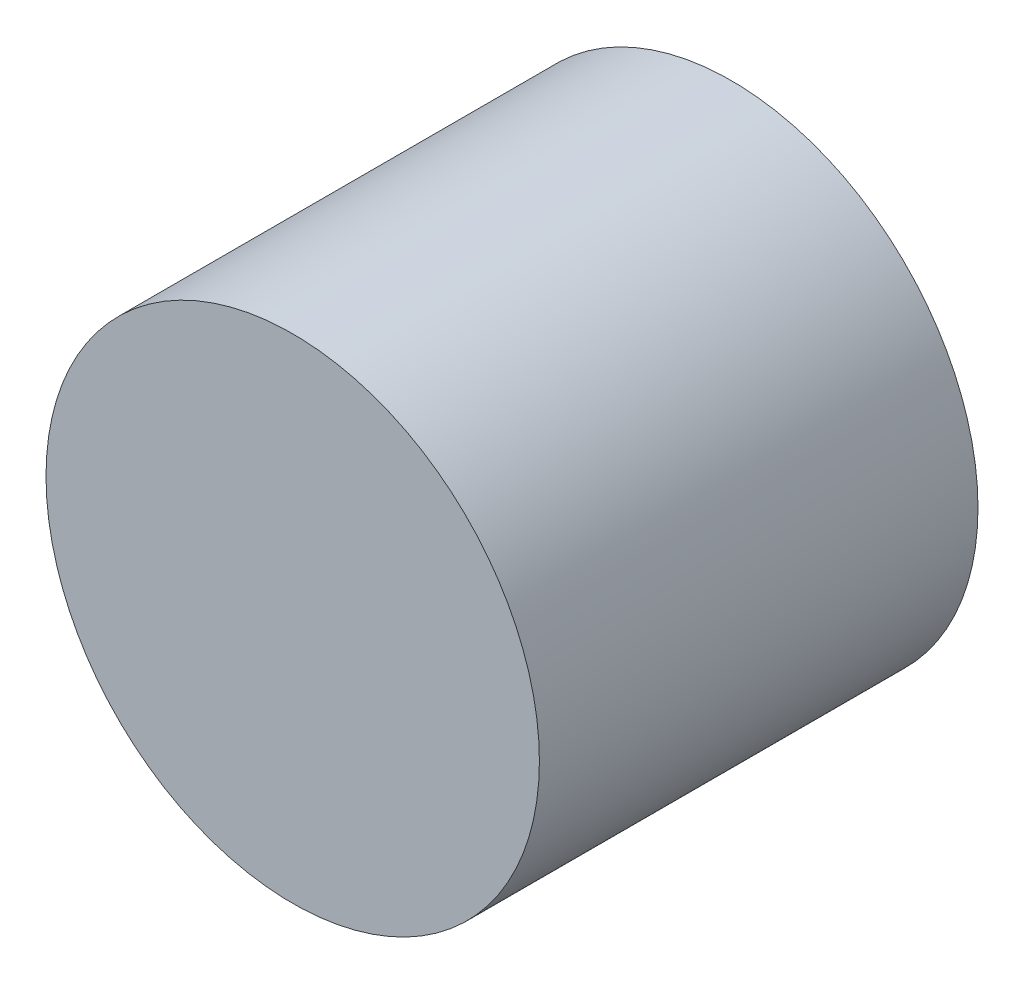
ISO-10303-21;
HEADER;
FILE_DESCRIPTION(('STEP AP214'),'2;1');
FILE_NAME('part.step','',(''),(''),'','','');
FILE_SCHEMA(('AUTOMOTIVE_DESIGN { 1 0 10303 214 1 1 1 1 }'));
ENDSEC;
DATA;
#1=APPLICATION_CONTEXT('core data for automotive mechanical design processes');
#2=APPLICATION_PROTOCOL_DEFINITION('international standard','automotive_design',2000,#1);
#3=PRODUCT_CONTEXT('',#1,'mechanical');
#4=PRODUCT('Part','Part','',(#3));
#5=PRODUCT_RELATED_PRODUCT_CATEGORY('part','',(#4));
#6=PRODUCT_DEFINITION_FORMATION('','',#4);
#7=PRODUCT_DEFINITION_CONTEXT('part definition',#1,'design');
#8=PRODUCT_DEFINITION('design','',#6,#7);
#9=PRODUCT_DEFINITION_SHAPE('','',#8);
#10=(LENGTH_UNIT() NAMED_UNIT(*) SI_UNIT(.MILLI.,.METRE.));
#11=(NAMED_UNIT(*) PLANE_ANGLE_UNIT() SI_UNIT($,.RADIAN.));
#12=(NAMED_UNIT(*) SI_UNIT($,.STERADIAN.) SOLID_ANGLE_UNIT());
#13=UNCERTAINTY_MEASURE_WITH_UNIT(LENGTH_MEASURE(1.E-05),#10,'distance_accuracy_value','');
#14=(GEOMETRIC_REPRESENTATION_CONTEXT(3) GLOBAL_UNCERTAINTY_ASSIGNED_CONTEXT((#13)) GLOBAL_UNIT_ASSIGNED_CONTEXT((#10,
#11,#12)) REPRESENTATION_CONTEXT('',''));
#15=CARTESIAN_POINT('',(0.,0.,0.));
#16=DIRECTION('',(0.,0.,1.));
#17=DIRECTION('',(1.,0.,0.));
#18=AXIS2_PLACEMENT_3D('',#15,#16,#17);
#19=CARTESIAN_POINT('',(0.,0.,0.));
#20=DIRECTION('',(0.,0.,1.));
#21=DIRECTION('',(1.,0.,0.));
#22=AXIS2_PLACEMENT_3D('',#19,#20,#21);
#23=PLANE('',#22);
#24=CARTESIAN_POINT('',(0.,0.,0.));
#25=DIRECTION('',(0.,0.,1.));
#26=DIRECTION('',(1.,0.,0.));
#27=AXIS2_PLACEMENT_3D('',#24,#25,#26);
#28=CIRCLE('',#27,22.5);
#29=CARTESIAN_POINT('',(-22.5,0.,0.));
#30=VERTEX_POINT('',#29);
#31=EDGE_CURVE('E11',#30,#30,#28,.T.);
#32=ORIENTED_EDGE('',*,*,#31,.F.);
#33=EDGE_LOOP('',(#32));
#34=FACE_BOUND('',#33,.T.);
#35=ADVANCED_FACE('F17',(#34),#23,.F.);
#36=CARTESIAN_POINT('',(0.,0.,40.));
#37=DIRECTION('',(0.,0.,1.));
#38=DIRECTION('',(1.,0.,0.));
#39=AXIS2_PLACEMENT_3D('',#36,#37,#38);
#40=PLANE('',#39);
#41=CARTESIAN_POINT('',(0.,0.,40.));
#42=DIRECTION('',(0.,0.,1.));
#43=DIRECTION('',(1.,0.,0.));
#44=AXIS2_PLACEMENT_3D('',#41,#42,#43);
#45=CIRCLE('',#44,22.5);
#46=CARTESIAN_POINT('',(-22.5,0.,40.));
#47=VERTEX_POINT('',#46);
#48=EDGE_CURVE('E41',#47,#47,#45,.T.);
#49=ORIENTED_EDGE('',*,*,#48,.T.);
#50=EDGE_LOOP('',(#49));
#51=FACE_BOUND('',#50,.T.);
#52=ADVANCED_FACE('F42',(#51),#40,.T.);
#53=CARTESIAN_POINT('',(0.,0.,0.));
#54=DIRECTION('',(0.,0.,1.));
#55=DIRECTION('',(1.,0.,0.));
#56=AXIS2_PLACEMENT_3D('',#53,#54,#55);
#57=CYLINDRICAL_SURFACE('',#56,22.5);
#58=ORIENTED_EDGE('',*,*,#48,.F.);
#59=DIRECTION('',(0.,0.,-1.));
#60=VECTOR('',#59,1.);
#61=CARTESIAN_POINT('',(-22.5,0.,0.));
#62=LINE('',#61,#60);
#63=EDGE_CURVE('E20',#47,#30,#62,.T.);
#64=ORIENTED_EDGE('',*,*,#63,.T.);
#65=ORIENTED_EDGE('',*,*,#31,.T.);
#66=ORIENTED_EDGE('',*,*,#63,.F.);
#67=EDGE_LOOP('',(#58,#64,#65,#66));
#68=FACE_BOUND('',#67,.T.);
#69=ADVANCED_FACE('F37',(#68),#57,.T.);
#70=CLOSED_SHELL('',(#35,#52,#69));
#71=MANIFOLD_SOLID_BREP('B1',#70);
#72=ADVANCED_BREP_SHAPE_REPRESENTATION('',(#18,#71),#14);
#73=SHAPE_DEFINITION_REPRESENTATION(#9,#72);
ENDSEC;
END-ISO-10303-21;
